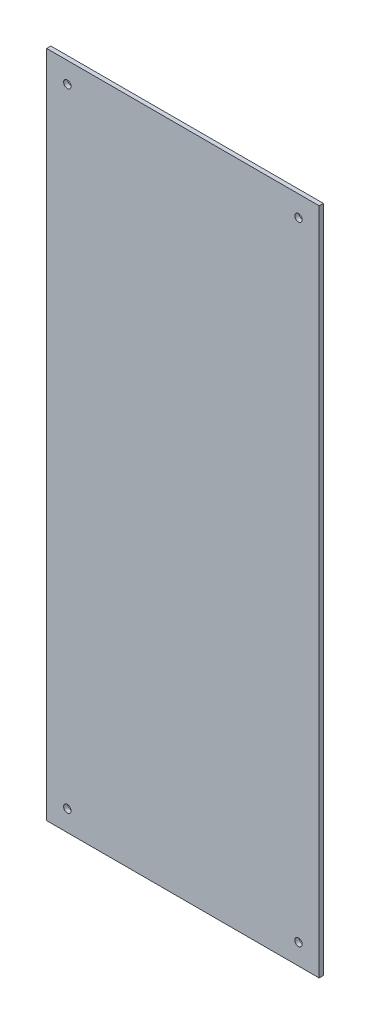
ISO-10303-21;
HEADER;
FILE_DESCRIPTION(('STEP AP214'),'2;1');
FILE_NAME('part.step','',(''),(''),'','','');
FILE_SCHEMA(('AUTOMOTIVE_DESIGN { 1 0 10303 214 1 1 1 1 }'));
ENDSEC;
DATA;
#1=APPLICATION_CONTEXT('core data for automotive mechanical design processes');
#2=APPLICATION_PROTOCOL_DEFINITION('international standard','automotive_design',2000,#1);
#3=PRODUCT_CONTEXT('',#1,'mechanical');
#4=PRODUCT('Part','Part','',(#3));
#5=PRODUCT_RELATED_PRODUCT_CATEGORY('part','',(#4));
#6=PRODUCT_DEFINITION_FORMATION('','',#4);
#7=PRODUCT_DEFINITION_CONTEXT('part definition',#1,'design');
#8=PRODUCT_DEFINITION('design','',#6,#7);
#9=PRODUCT_DEFINITION_SHAPE('','',#8);
#10=(LENGTH_UNIT() NAMED_UNIT(*) SI_UNIT(.MILLI.,.METRE.));
#11=(NAMED_UNIT(*) PLANE_ANGLE_UNIT() SI_UNIT($,.RADIAN.));
#12=(NAMED_UNIT(*) SI_UNIT($,.STERADIAN.) SOLID_ANGLE_UNIT());
#13=UNCERTAINTY_MEASURE_WITH_UNIT(LENGTH_MEASURE(1.E-05),#10,'distance_accuracy_value','');
#14=(GEOMETRIC_REPRESENTATION_CONTEXT(3) GLOBAL_UNCERTAINTY_ASSIGNED_CONTEXT((#13)) GLOBAL_UNIT_ASSIGNED_CONTEXT((#10,
#11,#12)) REPRESENTATION_CONTEXT('',''));
#15=CARTESIAN_POINT('',(0.,0.,0.));
#16=DIRECTION('',(0.,0.,1.));
#17=DIRECTION('',(1.,0.,0.));
#18=AXIS2_PLACEMENT_3D('',#15,#16,#17);
#19=CARTESIAN_POINT('',(0.,0.,3.175));
#20=DIRECTION('',(0.,0.,-1.));
#21=DIRECTION('',(-1.,0.,0.));
#22=AXIS2_PLACEMENT_3D('',#19,#20,#21);
#23=PLANE('',#22);
#24=CARTESIAN_POINT('',(-87.5,-237.5,3.175));
#25=DIRECTION('',(0.,0.,1.));
#26=DIRECTION('',(1.,0.,0.));
#27=AXIS2_PLACEMENT_3D('',#24,#25,#26);
#28=CIRCLE('',#27,2.8);
#29=CARTESIAN_POINT('',(-84.7,-237.5,3.175));
#30=VERTEX_POINT('',#29);
#31=EDGE_CURVE('E11',#30,#30,#28,.T.);
#32=ORIENTED_EDGE('',*,*,#31,.F.);
#33=EDGE_LOOP('',(#32));
#34=FACE_BOUND('',#33,.T.);
#35=CARTESIAN_POINT('',(-87.5,237.5,3.175));
#36=DIRECTION('',(0.,0.,1.));
#37=DIRECTION('',(1.,0.,0.));
#38=AXIS2_PLACEMENT_3D('',#35,#36,#37);
#39=CIRCLE('',#38,2.8);
#40=CARTESIAN_POINT('',(-84.7,237.5,3.175));
#41=VERTEX_POINT('',#40);
#42=EDGE_CURVE('E153',#41,#41,#39,.T.);
#43=ORIENTED_EDGE('',*,*,#42,.F.);
#44=EDGE_LOOP('',(#43));
#45=FACE_BOUND('',#44,.T.);
#46=CARTESIAN_POINT('',(87.5,237.5,3.175));
#47=DIRECTION('',(0.,0.,1.));
#48=DIRECTION('',(1.,0.,0.));
#49=AXIS2_PLACEMENT_3D('',#46,#47,#48);
#50=CIRCLE('',#49,2.8);
#51=CARTESIAN_POINT('',(90.3,237.5,3.175));
#52=VERTEX_POINT('',#51);
#53=EDGE_CURVE('E145',#52,#52,#50,.T.);
#54=ORIENTED_EDGE('',*,*,#53,.F.);
#55=EDGE_LOOP('',(#54));
#56=FACE_BOUND('',#55,.T.);
#57=CARTESIAN_POINT('',(87.5,-237.5,3.175));
#58=DIRECTION('',(0.,0.,1.));
#59=DIRECTION('',(1.,0.,0.));
#60=AXIS2_PLACEMENT_3D('',#57,#58,#59);
#61=CIRCLE('',#60,2.8);
#62=CARTESIAN_POINT('',(90.3,-237.5,3.175));
#63=VERTEX_POINT('',#62);
#64=EDGE_CURVE('E137',#63,#63,#61,.T.);
#65=ORIENTED_EDGE('',*,*,#64,.F.);
#66=EDGE_LOOP('',(#65));
#67=FACE_BOUND('',#66,.T.);
#68=DIRECTION('',(0.,1.,0.));
#69=VECTOR('',#68,1.);
#70=CARTESIAN_POINT('',(103.175,-253.175,3.175));
#71=LINE('',#70,#69);
#72=CARTESIAN_POINT('',(103.175,-253.175,3.175));
#73=VERTEX_POINT('',#72);
#74=CARTESIAN_POINT('',(103.175,253.175,3.175));
#75=VERTEX_POINT('',#74);
#76=EDGE_CURVE('E118',#73,#75,#71,.T.);
#77=ORIENTED_EDGE('',*,*,#76,.T.);
#78=DIRECTION('',(-1.,0.,0.));
#79=VECTOR('',#78,1.);
#80=CARTESIAN_POINT('',(-103.175,253.175,3.175));
#81=LINE('',#80,#79);
#82=CARTESIAN_POINT('',(-103.175,253.175,3.175));
#83=VERTEX_POINT('',#82);
#84=EDGE_CURVE('E122',#75,#83,#81,.T.);
#85=ORIENTED_EDGE('',*,*,#84,.T.);
#86=DIRECTION('',(0.,-1.,0.));
#87=VECTOR('',#86,1.);
#88=CARTESIAN_POINT('',(-103.175,-253.175,3.175));
#89=LINE('',#88,#87);
#90=CARTESIAN_POINT('',(-103.175,-253.175,3.175));
#91=VERTEX_POINT('',#90);
#92=EDGE_CURVE('E99',#83,#91,#89,.T.);
#93=ORIENTED_EDGE('',*,*,#92,.T.);
#94=DIRECTION('',(1.,0.,0.));
#95=VECTOR('',#94,1.);
#96=CARTESIAN_POINT('',(-103.175,-253.175,3.175));
#97=LINE('',#96,#95);
#98=EDGE_CURVE('E113',#91,#73,#97,.T.);
#99=ORIENTED_EDGE('',*,*,#98,.T.);
#100=EDGE_LOOP('',(#77,#85,#93,#99));
#101=FACE_BOUND('',#100,.T.);
#102=ADVANCED_FACE('F45',(#34,#45,#56,#67,#101),#23,.F.);
#103=CARTESIAN_POINT('',(0.,0.,0.));
#104=DIRECTION('',(0.,0.,-1.));
#105=DIRECTION('',(-1.,0.,0.));
#106=AXIS2_PLACEMENT_3D('',#103,#104,#105);
#107=PLANE('',#106);
#108=CARTESIAN_POINT('',(87.5,237.5,0.));
#109=DIRECTION('',(0.,0.,1.));
#110=DIRECTION('',(1.,0.,0.));
#111=AXIS2_PLACEMENT_3D('',#108,#109,#110);
#112=CIRCLE('',#111,2.8);
#113=CARTESIAN_POINT('',(90.3,237.5,0.));
#114=VERTEX_POINT('',#113);
#115=EDGE_CURVE('E141',#114,#114,#112,.T.);
#116=ORIENTED_EDGE('',*,*,#115,.T.);
#117=EDGE_LOOP('',(#116));
#118=FACE_BOUND('',#117,.T.);
#119=CARTESIAN_POINT('',(-87.5,-237.5,0.));
#120=DIRECTION('',(0.,0.,1.));
#121=DIRECTION('',(1.,0.,0.));
#122=AXIS2_PLACEMENT_3D('',#119,#120,#121);
#123=CIRCLE('',#122,2.8);
#124=CARTESIAN_POINT('',(-84.7,-237.5,0.));
#125=VERTEX_POINT('',#124);
#126=EDGE_CURVE('E49',#125,#125,#123,.T.);
#127=ORIENTED_EDGE('',*,*,#126,.T.);
#128=EDGE_LOOP('',(#127));
#129=FACE_BOUND('',#128,.T.);
#130=CARTESIAN_POINT('',(-87.5,237.5,0.));
#131=DIRECTION('',(0.,0.,1.));
#132=DIRECTION('',(1.,0.,0.));
#133=AXIS2_PLACEMENT_3D('',#130,#131,#132);
#134=CIRCLE('',#133,2.8);
#135=CARTESIAN_POINT('',(-84.7,237.5,0.));
#136=VERTEX_POINT('',#135);
#137=EDGE_CURVE('E149',#136,#136,#134,.T.);
#138=ORIENTED_EDGE('',*,*,#137,.T.);
#139=EDGE_LOOP('',(#138));
#140=FACE_BOUND('',#139,.T.);
#141=CARTESIAN_POINT('',(87.5,-237.5,0.));
#142=DIRECTION('',(0.,0.,1.));
#143=DIRECTION('',(1.,0.,0.));
#144=AXIS2_PLACEMENT_3D('',#141,#142,#143);
#145=CIRCLE('',#144,2.8);
#146=CARTESIAN_POINT('',(90.3,-237.5,0.));
#147=VERTEX_POINT('',#146);
#148=EDGE_CURVE('E132',#147,#147,#145,.T.);
#149=ORIENTED_EDGE('',*,*,#148,.T.);
#150=EDGE_LOOP('',(#149));
#151=FACE_BOUND('',#150,.T.);
#152=DIRECTION('',(0.,1.,0.));
#153=VECTOR('',#152,1.);
#154=CARTESIAN_POINT('',(103.175,-253.175,0.));
#155=LINE('',#154,#153);
#156=CARTESIAN_POINT('',(103.175,-253.175,0.));
#157=VERTEX_POINT('',#156);
#158=CARTESIAN_POINT('',(103.175,253.175,0.));
#159=VERTEX_POINT('',#158);
#160=EDGE_CURVE('E110',#157,#159,#155,.T.);
#161=ORIENTED_EDGE('',*,*,#160,.F.);
#162=DIRECTION('',(1.,0.,0.));
#163=VECTOR('',#162,1.);
#164=CARTESIAN_POINT('',(-103.175,-253.175,0.));
#165=LINE('',#164,#163);
#166=CARTESIAN_POINT('',(-103.175,-253.175,0.));
#167=VERTEX_POINT('',#166);
#168=EDGE_CURVE('E105',#167,#157,#165,.T.);
#169=ORIENTED_EDGE('',*,*,#168,.F.);
#170=DIRECTION('',(0.,-1.,0.));
#171=VECTOR('',#170,1.);
#172=CARTESIAN_POINT('',(-103.175,-253.175,0.));
#173=LINE('',#172,#171);
#174=CARTESIAN_POINT('',(-103.175,253.175,0.));
#175=VERTEX_POINT('',#174);
#176=EDGE_CURVE('E97',#175,#167,#173,.T.);
#177=ORIENTED_EDGE('',*,*,#176,.F.);
#178=DIRECTION('',(-1.,0.,0.));
#179=VECTOR('',#178,1.);
#180=CARTESIAN_POINT('',(-103.175,253.175,0.));
#181=LINE('',#180,#179);
#182=EDGE_CURVE('E104',#159,#175,#181,.T.);
#183=ORIENTED_EDGE('',*,*,#182,.F.);
#184=EDGE_LOOP('',(#161,#169,#177,#183));
#185=FACE_BOUND('',#184,.T.);
#186=ADVANCED_FACE('F47',(#118,#129,#140,#151,#185),#107,.T.);
#187=CARTESIAN_POINT('',(-87.5,-237.5,3.175));
#188=DIRECTION('',(0.,0.,-1.));
#189=DIRECTION('',(-1.,0.,0.));
#190=AXIS2_PLACEMENT_3D('',#187,#188,#189);
#191=CYLINDRICAL_SURFACE('',#190,2.8);
#192=ORIENTED_EDGE('',*,*,#31,.T.);
#193=EDGE_LOOP('',(#192));
#194=FACE_BOUND('',#193,.T.);
#195=ORIENTED_EDGE('',*,*,#126,.F.);
#196=EDGE_LOOP('',(#195));
#197=FACE_BOUND('',#196,.T.);
#198=ADVANCED_FACE('F166',(#194,#197),#191,.F.);
#199=CARTESIAN_POINT('',(-87.5,237.5,3.175));
#200=DIRECTION('',(0.,0.,-1.));
#201=DIRECTION('',(-1.,0.,0.));
#202=AXIS2_PLACEMENT_3D('',#199,#200,#201);
#203=CYLINDRICAL_SURFACE('',#202,2.8);
#204=ORIENTED_EDGE('',*,*,#42,.T.);
#205=EDGE_LOOP('',(#204));
#206=FACE_BOUND('',#205,.T.);
#207=ORIENTED_EDGE('',*,*,#137,.F.);
#208=EDGE_LOOP('',(#207));
#209=FACE_BOUND('',#208,.T.);
#210=ADVANCED_FACE('F163',(#206,#209),#203,.F.);
#211=CARTESIAN_POINT('',(87.5,237.5,3.175));
#212=DIRECTION('',(0.,0.,-1.));
#213=DIRECTION('',(-1.,0.,0.));
#214=AXIS2_PLACEMENT_3D('',#211,#212,#213);
#215=CYLINDRICAL_SURFACE('',#214,2.8);
#216=ORIENTED_EDGE('',*,*,#53,.T.);
#217=EDGE_LOOP('',(#216));
#218=FACE_BOUND('',#217,.T.);
#219=ORIENTED_EDGE('',*,*,#115,.F.);
#220=EDGE_LOOP('',(#219));
#221=FACE_BOUND('',#220,.T.);
#222=ADVANCED_FACE('F165',(#218,#221),#215,.F.);
#223=CARTESIAN_POINT('',(87.5,-237.5,3.175));
#224=DIRECTION('',(0.,0.,-1.));
#225=DIRECTION('',(-1.,0.,0.));
#226=AXIS2_PLACEMENT_3D('',#223,#224,#225);
#227=CYLINDRICAL_SURFACE('',#226,2.8);
#228=ORIENTED_EDGE('',*,*,#64,.T.);
#229=EDGE_LOOP('',(#228));
#230=FACE_BOUND('',#229,.T.);
#231=ORIENTED_EDGE('',*,*,#148,.F.);
#232=EDGE_LOOP('',(#231));
#233=FACE_BOUND('',#232,.T.);
#234=ADVANCED_FACE('F173',(#230,#233),#227,.F.);
#235=CARTESIAN_POINT('',(103.175,-253.175,0.));
#236=DIRECTION('',(1.,0.,0.));
#237=DIRECTION('',(0.,0.,-1.));
#238=AXIS2_PLACEMENT_3D('',#235,#236,#237);
#239=PLANE('',#238);
#240=ORIENTED_EDGE('',*,*,#76,.F.);
#241=DIRECTION('',(0.,0.,1.));
#242=VECTOR('',#241,1.);
#243=CARTESIAN_POINT('',(103.175,-253.175,0.));
#244=LINE('',#243,#242);
#245=EDGE_CURVE('E63',#157,#73,#244,.T.);
#246=ORIENTED_EDGE('',*,*,#245,.F.);
#247=ORIENTED_EDGE('',*,*,#160,.T.);
#248=DIRECTION('',(0.,0.,1.));
#249=VECTOR('',#248,1.);
#250=CARTESIAN_POINT('',(103.175,253.175,0.));
#251=LINE('',#250,#249);
#252=EDGE_CURVE('E91',#159,#75,#251,.T.);
#253=ORIENTED_EDGE('',*,*,#252,.T.);
#254=EDGE_LOOP('',(#240,#246,#247,#253));
#255=FACE_BOUND('',#254,.T.);
#256=ADVANCED_FACE('F193',(#255),#239,.T.);
#257=CARTESIAN_POINT('',(-103.175,-253.175,0.));
#258=DIRECTION('',(0.,-1.,0.));
#259=DIRECTION('',(0.,0.,-1.));
#260=AXIS2_PLACEMENT_3D('',#257,#258,#259);
#261=PLANE('',#260);
#262=ORIENTED_EDGE('',*,*,#98,.F.);
#263=DIRECTION('',(0.,0.,1.));
#264=VECTOR('',#263,1.);
#265=CARTESIAN_POINT('',(-103.175,-253.175,0.));
#266=LINE('',#265,#264);
#267=EDGE_CURVE('E80',#167,#91,#266,.T.);
#268=ORIENTED_EDGE('',*,*,#267,.F.);
#269=ORIENTED_EDGE('',*,*,#168,.T.);
#270=ORIENTED_EDGE('',*,*,#245,.T.);
#271=EDGE_LOOP('',(#262,#268,#269,#270));
#272=FACE_BOUND('',#271,.T.);
#273=ADVANCED_FACE('F194',(#272),#261,.T.);
#274=CARTESIAN_POINT('',(-103.175,-253.175,0.));
#275=DIRECTION('',(-1.,0.,0.));
#276=DIRECTION('',(0.,0.,1.));
#277=AXIS2_PLACEMENT_3D('',#274,#275,#276);
#278=PLANE('',#277);
#279=ORIENTED_EDGE('',*,*,#92,.F.);
#280=DIRECTION('',(0.,0.,1.));
#281=VECTOR('',#280,1.);
#282=CARTESIAN_POINT('',(-103.175,253.175,0.));
#283=LINE('',#282,#281);
#284=EDGE_CURVE('E94',#175,#83,#283,.T.);
#285=ORIENTED_EDGE('',*,*,#284,.F.);
#286=ORIENTED_EDGE('',*,*,#176,.T.);
#287=ORIENTED_EDGE('',*,*,#267,.T.);
#288=EDGE_LOOP('',(#279,#285,#286,#287));
#289=FACE_BOUND('',#288,.T.);
#290=ADVANCED_FACE('F96',(#289),#278,.T.);
#291=CARTESIAN_POINT('',(-103.175,253.175,0.));
#292=DIRECTION('',(0.,1.,0.));
#293=DIRECTION('',(0.,0.,1.));
#294=AXIS2_PLACEMENT_3D('',#291,#292,#293);
#295=PLANE('',#294);
#296=ORIENTED_EDGE('',*,*,#84,.F.);
#297=ORIENTED_EDGE('',*,*,#252,.F.);
#298=ORIENTED_EDGE('',*,*,#182,.T.);
#299=ORIENTED_EDGE('',*,*,#284,.T.);
#300=EDGE_LOOP('',(#296,#297,#298,#299));
#301=FACE_BOUND('',#300,.T.);
#302=ADVANCED_FACE('F108',(#301),#295,.T.);
#303=CLOSED_SHELL('',(#102,#186,#198,#210,#222,#234,#256,#273,#290,#302));
#304=MANIFOLD_SOLID_BREP('B2',#303);
#305=ADVANCED_BREP_SHAPE_REPRESENTATION('',(#18,#304),#14);
#306=SHAPE_DEFINITION_REPRESENTATION(#9,#305);
ENDSEC;
END-ISO-10303-21;
